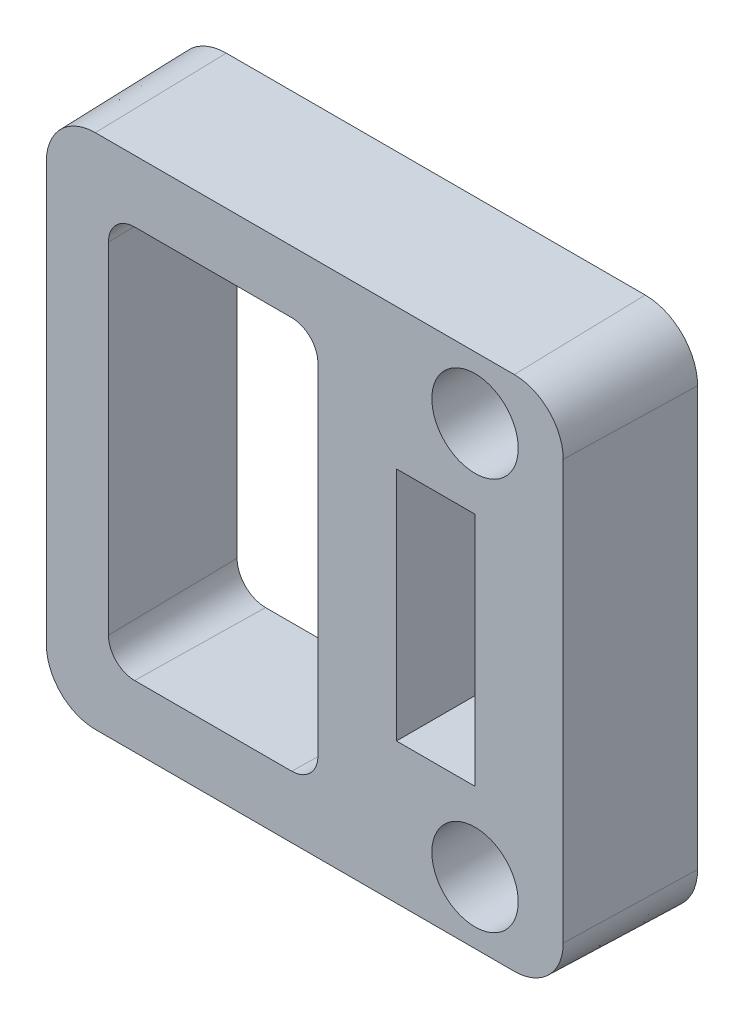
ISO-10303-21;
HEADER;
FILE_DESCRIPTION(('STEP AP214'),'2;1');
FILE_NAME('part.step','',(''),(''),'','','');
FILE_SCHEMA(('AUTOMOTIVE_DESIGN { 1 0 10303 214 1 1 1 1 }'));
ENDSEC;
DATA;
#1=APPLICATION_CONTEXT('core data for automotive mechanical design processes');
#2=APPLICATION_PROTOCOL_DEFINITION('international standard','automotive_design',2000,#1);
#3=PRODUCT_CONTEXT('',#1,'mechanical');
#4=PRODUCT('Part','Part','',(#3));
#5=PRODUCT_RELATED_PRODUCT_CATEGORY('part','',(#4));
#6=PRODUCT_DEFINITION_FORMATION('','',#4);
#7=PRODUCT_DEFINITION_CONTEXT('part definition',#1,'design');
#8=PRODUCT_DEFINITION('design','',#6,#7);
#9=PRODUCT_DEFINITION_SHAPE('','',#8);
#10=(LENGTH_UNIT() NAMED_UNIT(*) SI_UNIT(.MILLI.,.METRE.));
#11=(NAMED_UNIT(*) PLANE_ANGLE_UNIT() SI_UNIT($,.RADIAN.));
#12=(NAMED_UNIT(*) SI_UNIT($,.STERADIAN.) SOLID_ANGLE_UNIT());
#13=UNCERTAINTY_MEASURE_WITH_UNIT(LENGTH_MEASURE(1.E-05),#10,'distance_accuracy_value','');
#14=(GEOMETRIC_REPRESENTATION_CONTEXT(3) GLOBAL_UNCERTAINTY_ASSIGNED_CONTEXT((#13)) GLOBAL_UNIT_ASSIGNED_CONTEXT((#10,
#11,#12)) REPRESENTATION_CONTEXT('',''));
#15=CARTESIAN_POINT('',(0.,0.,0.));
#16=DIRECTION('',(0.,0.,1.));
#17=DIRECTION('',(1.,0.,0.));
#18=AXIS2_PLACEMENT_3D('',#15,#16,#17);
#19=CARTESIAN_POINT('',(0.,0.,5.));
#20=DIRECTION('',(0.,0.,-1.));
#21=DIRECTION('',(-1.,0.,0.));
#22=AXIS2_PLACEMENT_3D('',#19,#20,#21);
#23=PLANE('',#22);
#24=DIRECTION('',(-1.,0.,0.));
#25=VECTOR('',#24,1.);
#26=CARTESIAN_POINT('',(0.,-9.86907039215407,5.));
#27=LINE('',#26,#25);
#28=CARTESIAN_POINT('',(-8.,-9.86907039215407,5.));
#29=VERTEX_POINT('',#28);
#30=CARTESIAN_POINT('',(8.,-9.86907039215407,5.));
#31=VERTEX_POINT('',#30);
#32=EDGE_CURVE('E255',#29,#31,#27,.F.);
#33=ORIENTED_EDGE('',*,*,#32,.T.);
#34=CARTESIAN_POINT('',(8.,-8.,5.));
#35=DIRECTION('',(0.,0.,-1.));
#36=DIRECTION('',(-1.,0.,0.));
#37=AXIS2_PLACEMENT_3D('',#34,#35,#36);
#38=CIRCLE('',#37,1.86907039215406);
#39=CARTESIAN_POINT('',(9.86907039215406,-8.,5.));
#40=VERTEX_POINT('',#39);
#41=EDGE_CURVE('E244',#31,#40,#38,.F.);
#42=ORIENTED_EDGE('',*,*,#41,.T.);
#43=DIRECTION('',(0.,-1.,0.));
#44=VECTOR('',#43,1.);
#45=CARTESIAN_POINT('',(9.86907039215406,0.,5.));
#46=LINE('',#45,#44);
#47=CARTESIAN_POINT('',(9.86907039215406,8.,5.));
#48=VERTEX_POINT('',#47);
#49=EDGE_CURVE('E212',#40,#48,#46,.F.);
#50=ORIENTED_EDGE('',*,*,#49,.T.);
#51=CARTESIAN_POINT('',(8.,8.,5.));
#52=DIRECTION('',(0.,0.,-1.));
#53=DIRECTION('',(-1.,0.,0.));
#54=AXIS2_PLACEMENT_3D('',#51,#52,#53);
#55=CIRCLE('',#54,1.86907039215406);
#56=CARTESIAN_POINT('',(8.,9.86907039215407,5.));
#57=VERTEX_POINT('',#56);
#58=EDGE_CURVE('E242',#48,#57,#55,.F.);
#59=ORIENTED_EDGE('',*,*,#58,.T.);
#60=DIRECTION('',(1.,0.,0.));
#61=VECTOR('',#60,1.);
#62=CARTESIAN_POINT('',(0.,9.86907039215407,5.));
#63=LINE('',#62,#61);
#64=CARTESIAN_POINT('',(-8.,9.86907039215407,5.));
#65=VERTEX_POINT('',#64);
#66=EDGE_CURVE('E245',#57,#65,#63,.F.);
#67=ORIENTED_EDGE('',*,*,#66,.T.);
#68=CARTESIAN_POINT('',(-8.,8.,5.));
#69=DIRECTION('',(0.,0.,-1.));
#70=DIRECTION('',(-1.,0.,0.));
#71=AXIS2_PLACEMENT_3D('',#68,#69,#70);
#72=CIRCLE('',#71,1.86907039215406);
#73=CARTESIAN_POINT('',(-9.86907039215407,8.,5.));
#74=VERTEX_POINT('',#73);
#75=EDGE_CURVE('E246',#65,#74,#72,.F.);
#76=ORIENTED_EDGE('',*,*,#75,.T.);
#77=DIRECTION('',(0.,1.,0.));
#78=VECTOR('',#77,1.);
#79=CARTESIAN_POINT('',(-9.86907039215407,0.,5.));
#80=LINE('',#79,#78);
#81=CARTESIAN_POINT('',(-9.86907039215407,-8.,5.));
#82=VERTEX_POINT('',#81);
#83=EDGE_CURVE('E247',#74,#82,#80,.F.);
#84=ORIENTED_EDGE('',*,*,#83,.T.);
#85=CARTESIAN_POINT('',(-8.,-8.,5.));
#86=DIRECTION('',(0.,0.,-1.));
#87=DIRECTION('',(-1.,0.,0.));
#88=AXIS2_PLACEMENT_3D('',#85,#86,#87);
#89=CIRCLE('',#88,1.86907039215406);
#90=EDGE_CURVE('E253',#82,#29,#89,.F.);
#91=ORIENTED_EDGE('',*,*,#90,.T.);
#92=EDGE_LOOP('',(#33,#42,#50,#59,#67,#76,#84,#91));
#93=FACE_BOUND('',#92,.T.);
#94=CARTESIAN_POINT('',(6.5,7.5,5.));
#95=DIRECTION('',(0.,0.,1.));
#96=DIRECTION('',(1.,0.,0.));
#97=AXIS2_PLACEMENT_3D('',#94,#95,#96);
#98=CIRCLE('',#97,1.65);
#99=CARTESIAN_POINT('',(8.15,7.5,5.));
#100=VERTEX_POINT('',#99);
#101=EDGE_CURVE('E195',#100,#100,#98,.T.);
#102=ORIENTED_EDGE('',*,*,#101,.F.);
#103=EDGE_LOOP('',(#102));
#104=FACE_BOUND('',#103,.T.);
#105=CARTESIAN_POINT('',(6.5,-7.5,5.));
#106=DIRECTION('',(0.,0.,1.));
#107=DIRECTION('',(-1.,0.,0.));
#108=AXIS2_PLACEMENT_3D('',#105,#106,#107);
#109=CIRCLE('',#108,1.65);
#110=CARTESIAN_POINT('',(4.85,-7.5,5.));
#111=VERTEX_POINT('',#110);
#112=EDGE_CURVE('E193',#111,#111,#109,.T.);
#113=ORIENTED_EDGE('',*,*,#112,.F.);
#114=EDGE_LOOP('',(#113));
#115=FACE_BOUND('',#114,.T.);
#116=DIRECTION('',(1.,0.,0.));
#117=VECTOR('',#116,1.);
#118=CARTESIAN_POINT('',(3.5,-4.5,5.));
#119=LINE('',#118,#117);
#120=CARTESIAN_POINT('',(3.5,-4.5,5.));
#121=VERTEX_POINT('',#120);
#122=CARTESIAN_POINT('',(6.5,-4.5,5.));
#123=VERTEX_POINT('',#122);
#124=EDGE_CURVE('E176',#121,#123,#119,.T.);
#125=ORIENTED_EDGE('',*,*,#124,.F.);
#126=DIRECTION('',(0.,-1.,0.));
#127=VECTOR('',#126,1.);
#128=CARTESIAN_POINT('',(3.5,4.5,5.));
#129=LINE('',#128,#127);
#130=CARTESIAN_POINT('',(3.5,4.5,5.));
#131=VERTEX_POINT('',#130);
#132=EDGE_CURVE('E179',#131,#121,#129,.T.);
#133=ORIENTED_EDGE('',*,*,#132,.F.);
#134=DIRECTION('',(-1.,0.,0.));
#135=VECTOR('',#134,1.);
#136=CARTESIAN_POINT('',(3.5,4.5,5.));
#137=LINE('',#136,#135);
#138=CARTESIAN_POINT('',(6.5,4.5,5.));
#139=VERTEX_POINT('',#138);
#140=EDGE_CURVE('E183',#139,#131,#137,.T.);
#141=ORIENTED_EDGE('',*,*,#140,.F.);
#142=DIRECTION('',(0.,1.,0.));
#143=VECTOR('',#142,1.);
#144=CARTESIAN_POINT('',(6.5,4.5,5.));
#145=LINE('',#144,#143);
#146=EDGE_CURVE('E163',#123,#139,#145,.T.);
#147=ORIENTED_EDGE('',*,*,#146,.F.);
#148=EDGE_LOOP('',(#125,#133,#141,#147));
#149=FACE_BOUND('',#148,.T.);
#150=DIRECTION('',(1.,0.,0.));
#151=VECTOR('',#150,1.);
#152=CARTESIAN_POINT('',(-7.5,-7.5,5.));
#153=LINE('',#152,#151);
#154=CARTESIAN_POINT('',(-6.5,-7.5,5.));
#155=VERTEX_POINT('',#154);
#156=CARTESIAN_POINT('',(-0.5,-7.5,5.));
#157=VERTEX_POINT('',#156);
#158=EDGE_CURVE('E306',#155,#157,#153,.T.);
#159=ORIENTED_EDGE('',*,*,#158,.F.);
#160=CARTESIAN_POINT('',(-6.5,-6.5,5.));
#161=DIRECTION('',(0.,0.,-1.));
#162=DIRECTION('',(-1.,0.,0.));
#163=AXIS2_PLACEMENT_3D('',#160,#161,#162);
#164=CIRCLE('',#163,1.);
#165=CARTESIAN_POINT('',(-7.5,-6.5,5.));
#166=VERTEX_POINT('',#165);
#167=EDGE_CURVE('E89',#155,#166,#164,.T.);
#168=ORIENTED_EDGE('',*,*,#167,.T.);
#169=DIRECTION('',(0.,1.,0.));
#170=VECTOR('',#169,1.);
#171=CARTESIAN_POINT('',(-7.5,-7.5,5.));
#172=LINE('',#171,#170);
#173=CARTESIAN_POINT('',(-7.5,6.5,5.));
#174=VERTEX_POINT('',#173);
#175=EDGE_CURVE('E327',#166,#174,#172,.T.);
#176=ORIENTED_EDGE('',*,*,#175,.T.);
#177=CARTESIAN_POINT('',(-6.5,6.5,5.));
#178=DIRECTION('',(0.,0.,-1.));
#179=DIRECTION('',(-1.,0.,0.));
#180=AXIS2_PLACEMENT_3D('',#177,#178,#179);
#181=CIRCLE('',#180,1.);
#182=CARTESIAN_POINT('',(-6.5,7.5,5.));
#183=VERTEX_POINT('',#182);
#184=EDGE_CURVE('E30',#174,#183,#181,.T.);
#185=ORIENTED_EDGE('',*,*,#184,.T.);
#186=DIRECTION('',(1.,0.,0.));
#187=VECTOR('',#186,1.);
#188=CARTESIAN_POINT('',(-7.5,7.5,5.));
#189=LINE('',#188,#187);
#190=CARTESIAN_POINT('',(-0.5,7.5,5.));
#191=VERTEX_POINT('',#190);
#192=EDGE_CURVE('E320',#183,#191,#189,.T.);
#193=ORIENTED_EDGE('',*,*,#192,.T.);
#194=CARTESIAN_POINT('',(-0.5,6.5,5.));
#195=DIRECTION('',(0.,0.,-1.));
#196=DIRECTION('',(-1.,0.,0.));
#197=AXIS2_PLACEMENT_3D('',#194,#195,#196);
#198=CIRCLE('',#197,1.);
#199=CARTESIAN_POINT('',(0.5,6.5,5.));
#200=VERTEX_POINT('',#199);
#201=EDGE_CURVE('E263',#191,#200,#198,.T.);
#202=ORIENTED_EDGE('',*,*,#201,.T.);
#203=DIRECTION('',(0.,1.,0.));
#204=VECTOR('',#203,1.);
#205=CARTESIAN_POINT('',(0.5,-7.5,5.));
#206=LINE('',#205,#204);
#207=CARTESIAN_POINT('',(0.5,-6.5,5.));
#208=VERTEX_POINT('',#207);
#209=EDGE_CURVE('E332',#208,#200,#206,.T.);
#210=ORIENTED_EDGE('',*,*,#209,.F.);
#211=CARTESIAN_POINT('',(-0.5,-6.5,5.));
#212=DIRECTION('',(0.,0.,-1.));
#213=DIRECTION('',(-1.,0.,0.));
#214=AXIS2_PLACEMENT_3D('',#211,#212,#213);
#215=CIRCLE('',#214,1.);
#216=EDGE_CURVE('E270',#208,#157,#215,.T.);
#217=ORIENTED_EDGE('',*,*,#216,.T.);
#218=EDGE_LOOP('',(#159,#168,#176,#185,#193,#202,#210,#217));
#219=FACE_BOUND('',#218,.T.);
#220=ADVANCED_FACE('F17',(#93,#104,#115,#149,#219),#23,.F.);
#221=CARTESIAN_POINT('',(0.,0.,0.));
#222=DIRECTION('',(0.,0.,-1.));
#223=DIRECTION('',(-1.,0.,0.));
#224=AXIS2_PLACEMENT_3D('',#221,#222,#223);
#225=PLANE('',#224);
#226=DIRECTION('',(0.,1.,0.));
#227=VECTOR('',#226,1.);
#228=CARTESIAN_POINT('',(3.41272467535891,4.5,0.));
#229=LINE('',#228,#227);
#230=CARTESIAN_POINT('',(3.41272467535891,4.58727532464109,0.));
#231=VERTEX_POINT('',#230);
#232=CARTESIAN_POINT('',(3.41272467535891,-4.58727532464109,0.));
#233=VERTEX_POINT('',#232);
#234=EDGE_CURVE('E184',#231,#233,#229,.F.);
#235=ORIENTED_EDGE('',*,*,#234,.T.);
#236=DIRECTION('',(-1.,0.,0.));
#237=VECTOR('',#236,1.);
#238=CARTESIAN_POINT('',(3.5,-4.58727532464109,0.));
#239=LINE('',#238,#237);
#240=CARTESIAN_POINT('',(6.58727532464109,-4.58727532464109,0.));
#241=VERTEX_POINT('',#240);
#242=EDGE_CURVE('E282',#233,#241,#239,.F.);
#243=ORIENTED_EDGE('',*,*,#242,.T.);
#244=DIRECTION('',(0.,-1.,0.));
#245=VECTOR('',#244,1.);
#246=CARTESIAN_POINT('',(6.58727532464109,4.5,0.));
#247=LINE('',#246,#245);
#248=CARTESIAN_POINT('',(6.58727532464109,4.58727532464109,0.));
#249=VERTEX_POINT('',#248);
#250=EDGE_CURVE('E170',#241,#249,#247,.F.);
#251=ORIENTED_EDGE('',*,*,#250,.T.);
#252=DIRECTION('',(1.,0.,0.));
#253=VECTOR('',#252,1.);
#254=CARTESIAN_POINT('',(3.5,4.58727532464109,0.));
#255=LINE('',#254,#253);
#256=EDGE_CURVE('E277',#249,#231,#255,.F.);
#257=ORIENTED_EDGE('',*,*,#256,.T.);
#258=EDGE_LOOP('',(#235,#243,#251,#257));
#259=FACE_BOUND('',#258,.T.);
#260=CARTESIAN_POINT('',(6.5,-7.5,0.));
#261=DIRECTION('',(0.,0.,1.));
#262=DIRECTION('',(-1.,0.,0.));
#263=AXIS2_PLACEMENT_3D('',#260,#261,#262);
#264=CIRCLE('',#263,1.65);
#265=CARTESIAN_POINT('',(4.85,-7.5,0.));
#266=VERTEX_POINT('',#265);
#267=EDGE_CURVE('E188',#266,#266,#264,.T.);
#268=ORIENTED_EDGE('',*,*,#267,.T.);
#269=EDGE_LOOP('',(#268));
#270=FACE_BOUND('',#269,.T.);
#271=CARTESIAN_POINT('',(6.5,7.5,0.));
#272=DIRECTION('',(0.,0.,1.));
#273=DIRECTION('',(1.,0.,0.));
#274=AXIS2_PLACEMENT_3D('',#271,#272,#273);
#275=CIRCLE('',#274,1.65);
#276=CARTESIAN_POINT('',(8.15,7.5,0.));
#277=VERTEX_POINT('',#276);
#278=EDGE_CURVE('E197',#277,#277,#275,.T.);
#279=ORIENTED_EDGE('',*,*,#278,.T.);
#280=EDGE_LOOP('',(#279));
#281=FACE_BOUND('',#280,.T.);
#282=DIRECTION('',(0.,1.,0.));
#283=VECTOR('',#282,1.);
#284=CARTESIAN_POINT('',(10.,-10.,0.));
#285=LINE('',#284,#283);
#286=CARTESIAN_POINT('',(10.,-8.,0.));
#287=VERTEX_POINT('',#286);
#288=CARTESIAN_POINT('',(10.,8.,0.));
#289=VERTEX_POINT('',#288);
#290=EDGE_CURVE('E199',#287,#289,#285,.T.);
#291=ORIENTED_EDGE('',*,*,#290,.F.);
#292=CARTESIAN_POINT('',(8.,-8.,0.));
#293=DIRECTION('',(0.,0.,-1.));
#294=DIRECTION('',(-1.,0.,0.));
#295=AXIS2_PLACEMENT_3D('',#292,#293,#294);
#296=CIRCLE('',#295,2.);
#297=CARTESIAN_POINT('',(8.,-10.,0.));
#298=VERTEX_POINT('',#297);
#299=EDGE_CURVE('E225',#287,#298,#296,.T.);
#300=ORIENTED_EDGE('',*,*,#299,.T.);
#301=DIRECTION('',(1.,0.,0.));
#302=VECTOR('',#301,1.);
#303=CARTESIAN_POINT('',(-10.,-10.,0.));
#304=LINE('',#303,#302);
#305=CARTESIAN_POINT('',(-8.,-10.,0.));
#306=VERTEX_POINT('',#305);
#307=EDGE_CURVE('E211',#306,#298,#304,.T.);
#308=ORIENTED_EDGE('',*,*,#307,.F.);
#309=CARTESIAN_POINT('',(-8.,-8.,0.));
#310=DIRECTION('',(0.,0.,-1.));
#311=DIRECTION('',(-1.,0.,0.));
#312=AXIS2_PLACEMENT_3D('',#309,#310,#311);
#313=CIRCLE('',#312,2.);
#314=CARTESIAN_POINT('',(-10.,-8.,0.));
#315=VERTEX_POINT('',#314);
#316=EDGE_CURVE('E214',#306,#315,#313,.T.);
#317=ORIENTED_EDGE('',*,*,#316,.T.);
#318=DIRECTION('',(0.,-1.,0.));
#319=VECTOR('',#318,1.);
#320=CARTESIAN_POINT('',(-10.,-10.,0.));
#321=LINE('',#320,#319);
#322=CARTESIAN_POINT('',(-10.,8.,0.));
#323=VERTEX_POINT('',#322);
#324=EDGE_CURVE('E208',#323,#315,#321,.T.);
#325=ORIENTED_EDGE('',*,*,#324,.F.);
#326=CARTESIAN_POINT('',(-8.,8.,0.));
#327=DIRECTION('',(0.,0.,-1.));
#328=DIRECTION('',(-1.,0.,0.));
#329=AXIS2_PLACEMENT_3D('',#326,#327,#328);
#330=CIRCLE('',#329,2.);
#331=CARTESIAN_POINT('',(-8.,10.,0.));
#332=VERTEX_POINT('',#331);
#333=EDGE_CURVE('E220',#323,#332,#330,.T.);
#334=ORIENTED_EDGE('',*,*,#333,.T.);
#335=DIRECTION('',(-1.,0.,0.));
#336=VECTOR('',#335,1.);
#337=CARTESIAN_POINT('',(-10.,10.,0.));
#338=LINE('',#337,#336);
#339=CARTESIAN_POINT('',(8.,10.,0.));
#340=VERTEX_POINT('',#339);
#341=EDGE_CURVE('E202',#340,#332,#338,.T.);
#342=ORIENTED_EDGE('',*,*,#341,.F.);
#343=CARTESIAN_POINT('',(8.,8.,0.));
#344=DIRECTION('',(0.,0.,-1.));
#345=DIRECTION('',(-1.,0.,0.));
#346=AXIS2_PLACEMENT_3D('',#343,#344,#345);
#347=CIRCLE('',#346,2.);
#348=EDGE_CURVE('E219',#340,#289,#347,.T.);
#349=ORIENTED_EDGE('',*,*,#348,.T.);
#350=EDGE_LOOP('',(#291,#300,#308,#317,#325,#334,#342,#349));
#351=FACE_BOUND('',#350,.T.);
#352=DIRECTION('',(1.,0.,0.));
#353=VECTOR('',#352,1.);
#354=CARTESIAN_POINT('',(-7.5,7.58727532464109,0.));
#355=LINE('',#354,#353);
#356=CARTESIAN_POINT('',(-6.5,7.58727532464109,0.));
#357=VERTEX_POINT('',#356);
#358=CARTESIAN_POINT('',(-0.5,7.58727532464109,0.));
#359=VERTEX_POINT('',#358);
#360=EDGE_CURVE('E301',#357,#359,#355,.T.);
#361=ORIENTED_EDGE('',*,*,#360,.F.);
#362=CARTESIAN_POINT('',(-6.5,6.5,0.));
#363=DIRECTION('',(0.,0.,-1.));
#364=DIRECTION('',(-1.,0.,0.));
#365=AXIS2_PLACEMENT_3D('',#362,#363,#364);
#366=CIRCLE('',#365,1.08727532464109);
#367=CARTESIAN_POINT('',(-7.58727532464109,6.5,0.));
#368=VERTEX_POINT('',#367);
#369=EDGE_CURVE('E11',#357,#368,#366,.F.);
#370=ORIENTED_EDGE('',*,*,#369,.T.);
#371=DIRECTION('',(0.,1.,0.));
#372=VECTOR('',#371,1.);
#373=CARTESIAN_POINT('',(-7.58727532464109,-7.5,0.));
#374=LINE('',#373,#372);
#375=CARTESIAN_POINT('',(-7.58727532464109,-6.5,0.));
#376=VERTEX_POINT('',#375);
#377=EDGE_CURVE('E302',#376,#368,#374,.T.);
#378=ORIENTED_EDGE('',*,*,#377,.F.);
#379=CARTESIAN_POINT('',(-6.5,-6.5,0.));
#380=DIRECTION('',(0.,0.,-1.));
#381=DIRECTION('',(-1.,0.,0.));
#382=AXIS2_PLACEMENT_3D('',#379,#380,#381);
#383=CIRCLE('',#382,1.08727532464109);
#384=CARTESIAN_POINT('',(-6.5,-7.58727532464109,0.));
#385=VERTEX_POINT('',#384);
#386=EDGE_CURVE('E85',#376,#385,#383,.F.);
#387=ORIENTED_EDGE('',*,*,#386,.T.);
#388=DIRECTION('',(-1.,0.,0.));
#389=VECTOR('',#388,1.);
#390=CARTESIAN_POINT('',(-7.5,-7.58727532464109,0.));
#391=LINE('',#390,#389);
#392=CARTESIAN_POINT('',(-0.5,-7.58727532464109,0.));
#393=VERTEX_POINT('',#392);
#394=EDGE_CURVE('E299',#385,#393,#391,.F.);
#395=ORIENTED_EDGE('',*,*,#394,.T.);
#396=CARTESIAN_POINT('',(-0.5,-6.5,0.));
#397=DIRECTION('',(0.,0.,-1.));
#398=DIRECTION('',(-1.,0.,0.));
#399=AXIS2_PLACEMENT_3D('',#396,#397,#398);
#400=CIRCLE('',#399,1.08727532464109);
#401=CARTESIAN_POINT('',(0.587275324641085,-6.5,0.));
#402=VERTEX_POINT('',#401);
#403=EDGE_CURVE('E269',#393,#402,#400,.F.);
#404=ORIENTED_EDGE('',*,*,#403,.T.);
#405=DIRECTION('',(0.,-1.,0.));
#406=VECTOR('',#405,1.);
#407=CARTESIAN_POINT('',(0.587275324641085,-7.5,0.));
#408=LINE('',#407,#406);
#409=CARTESIAN_POINT('',(0.587275324641085,6.5,0.));
#410=VERTEX_POINT('',#409);
#411=EDGE_CURVE('E300',#402,#410,#408,.F.);
#412=ORIENTED_EDGE('',*,*,#411,.T.);
#413=CARTESIAN_POINT('',(-0.5,6.5,0.));
#414=DIRECTION('',(0.,0.,-1.));
#415=DIRECTION('',(-1.,0.,0.));
#416=AXIS2_PLACEMENT_3D('',#413,#414,#415);
#417=CIRCLE('',#416,1.08727532464109);
#418=EDGE_CURVE('E264',#410,#359,#417,.F.);
#419=ORIENTED_EDGE('',*,*,#418,.T.);
#420=EDGE_LOOP('',(#361,#370,#378,#387,#395,#404,#412,#419));
#421=FACE_BOUND('',#420,.T.);
#422=ADVANCED_FACE('F319',(#259,#270,#281,#351,#421),#225,.T.);
#423=CARTESIAN_POINT('',(10.,-10.,0.));
#424=DIRECTION('',(0.999657324975557,0.,0.0261769483078732));
#425=DIRECTION('',(0.0261769483078732,0.,-0.999657324975557));
#426=AXIS2_PLACEMENT_3D('',#423,#424,#425);
#427=PLANE('',#426);
#428=ORIENTED_EDGE('',*,*,#49,.F.);
#429=DIRECTION('',(0.0261769483078732,0.,-0.999657324975557));
#430=VECTOR('',#429,1.);
#431=CARTESIAN_POINT('',(10.,-8.,0.));
#432=LINE('',#431,#430);
#433=EDGE_CURVE('E217',#40,#287,#432,.T.);
#434=ORIENTED_EDGE('',*,*,#433,.T.);
#435=ORIENTED_EDGE('',*,*,#290,.T.);
#436=DIRECTION('',(0.0261769483078732,0.,-0.999657324975557));
#437=VECTOR('',#436,1.);
#438=CARTESIAN_POINT('',(10.,8.,0.));
#439=LINE('',#438,#437);
#440=EDGE_CURVE('E227',#289,#48,#439,.F.);
#441=ORIENTED_EDGE('',*,*,#440,.T.);
#442=EDGE_LOOP('',(#428,#434,#435,#441));
#443=FACE_BOUND('',#442,.T.);
#444=ADVANCED_FACE('F344',(#443),#427,.T.);
#445=CARTESIAN_POINT('',(-10.,10.,0.));
#446=DIRECTION('',(0.,0.999657324975557,0.0261769483078732));
#447=DIRECTION('',(0.,-0.0261769483078732,0.999657324975557));
#448=AXIS2_PLACEMENT_3D('',#445,#446,#447);
#449=PLANE('',#448);
#450=ORIENTED_EDGE('',*,*,#66,.F.);
#451=DIRECTION('',(0.,0.0261769483078732,-0.999657324975557));
#452=VECTOR('',#451,1.);
#453=CARTESIAN_POINT('',(8.,10.,0.));
#454=LINE('',#453,#452);
#455=EDGE_CURVE('E240',#57,#340,#454,.T.);
#456=ORIENTED_EDGE('',*,*,#455,.T.);
#457=ORIENTED_EDGE('',*,*,#341,.T.);
#458=DIRECTION('',(0.,0.0261769483078732,-0.999657324975557));
#459=VECTOR('',#458,1.);
#460=CARTESIAN_POINT('',(-8.,10.,0.));
#461=LINE('',#460,#459);
#462=EDGE_CURVE('E237',#332,#65,#461,.F.);
#463=ORIENTED_EDGE('',*,*,#462,.T.);
#464=EDGE_LOOP('',(#450,#456,#457,#463));
#465=FACE_BOUND('',#464,.T.);
#466=ADVANCED_FACE('F370',(#465),#449,.T.);
#467=CARTESIAN_POINT('',(-10.,-10.,0.));
#468=DIRECTION('',(-0.999657324975557,0.,0.0261769483078732));
#469=DIRECTION('',(0.0261769483078732,0.,0.999657324975557));
#470=AXIS2_PLACEMENT_3D('',#467,#468,#469);
#471=PLANE('',#470);
#472=ORIENTED_EDGE('',*,*,#83,.F.);
#473=DIRECTION('',(-0.0261769483078732,0.,-0.999657324975557));
#474=VECTOR('',#473,1.);
#475=CARTESIAN_POINT('',(-10.,8.,0.));
#476=LINE('',#475,#474);
#477=EDGE_CURVE('E231',#74,#323,#476,.T.);
#478=ORIENTED_EDGE('',*,*,#477,.T.);
#479=ORIENTED_EDGE('',*,*,#324,.T.);
#480=DIRECTION('',(-0.0261769483078732,0.,-0.999657324975557));
#481=VECTOR('',#480,1.);
#482=CARTESIAN_POINT('',(-10.,-8.,0.));
#483=LINE('',#482,#481);
#484=EDGE_CURVE('E234',#315,#82,#483,.F.);
#485=ORIENTED_EDGE('',*,*,#484,.T.);
#486=EDGE_LOOP('',(#472,#478,#479,#485));
#487=FACE_BOUND('',#486,.T.);
#488=ADVANCED_FACE('F374',(#487),#471,.T.);
#489=CARTESIAN_POINT('',(-10.,-10.,0.));
#490=DIRECTION('',(0.,-0.999657324975557,0.0261769483078732));
#491=DIRECTION('',(0.,-0.0261769483078732,-0.999657324975557));
#492=AXIS2_PLACEMENT_3D('',#489,#490,#491);
#493=PLANE('',#492);
#494=ORIENTED_EDGE('',*,*,#307,.T.);
#495=DIRECTION('',(0.,-0.0261769483078732,-0.999657324975557));
#496=VECTOR('',#495,1.);
#497=CARTESIAN_POINT('',(8.,-10.,0.));
#498=LINE('',#497,#496);
#499=EDGE_CURVE('E230',#298,#31,#498,.F.);
#500=ORIENTED_EDGE('',*,*,#499,.T.);
#501=ORIENTED_EDGE('',*,*,#32,.F.);
#502=DIRECTION('',(0.,-0.0261769483078732,-0.999657324975557));
#503=VECTOR('',#502,1.);
#504=CARTESIAN_POINT('',(-8.,-10.,0.));
#505=LINE('',#504,#503);
#506=EDGE_CURVE('E221',#29,#306,#505,.T.);
#507=ORIENTED_EDGE('',*,*,#506,.T.);
#508=EDGE_LOOP('',(#494,#500,#501,#507));
#509=FACE_BOUND('',#508,.T.);
#510=ADVANCED_FACE('F383',(#509),#493,.T.);
#511=CARTESIAN_POINT('',(6.5,7.5,0.));
#512=DIRECTION('',(0.,0.,1.));
#513=DIRECTION('',(1.,0.,0.));
#514=AXIS2_PLACEMENT_3D('',#511,#512,#513);
#515=CYLINDRICAL_SURFACE('',#514,1.65);
#516=ORIENTED_EDGE('',*,*,#278,.F.);
#517=EDGE_LOOP('',(#516));
#518=FACE_BOUND('',#517,.T.);
#519=ORIENTED_EDGE('',*,*,#101,.T.);
#520=EDGE_LOOP('',(#519));
#521=FACE_BOUND('',#520,.T.);
#522=ADVANCED_FACE('F407',(#518,#521),#515,.F.);
#523=CARTESIAN_POINT('',(6.5,-7.5,0.));
#524=DIRECTION('',(0.,0.,1.));
#525=DIRECTION('',(1.,0.,0.));
#526=AXIS2_PLACEMENT_3D('',#523,#524,#525);
#527=CYLINDRICAL_SURFACE('',#526,1.65);
#528=ORIENTED_EDGE('',*,*,#267,.F.);
#529=EDGE_LOOP('',(#528));
#530=FACE_BOUND('',#529,.T.);
#531=ORIENTED_EDGE('',*,*,#112,.T.);
#532=EDGE_LOOP('',(#531));
#533=FACE_BOUND('',#532,.T.);
#534=ADVANCED_FACE('F431',(#530,#533),#527,.F.);
#535=CARTESIAN_POINT('',(3.5,4.5,5.));
#536=DIRECTION('',(0.999847695156391,0.,-0.0174524064372835));
#537=DIRECTION('',(-0.0174524064372835,0.,-0.999847695156391));
#538=AXIS2_PLACEMENT_3D('',#535,#536,#537);
#539=PLANE('',#538);
#540=ORIENTED_EDGE('',*,*,#132,.T.);
#541=DIRECTION('',(0.0174497491606827,0.0174497491606827,0.999695459881887));
#542=VECTOR('',#541,1.);
#543=CARTESIAN_POINT('',(3.50274044371193,-4.49725955628806,5.15699991510811));
#544=LINE('',#543,#542);
#545=EDGE_CURVE('E172',#233,#121,#544,.T.);
#546=ORIENTED_EDGE('',*,*,#545,.F.);
#547=ORIENTED_EDGE('',*,*,#234,.F.);
#548=DIRECTION('',(0.0174497491606827,-0.0174497491606827,0.999695459881887));
#549=VECTOR('',#548,1.);
#550=CARTESIAN_POINT('',(3.5,4.5,5.));
#551=LINE('',#550,#549);
#552=EDGE_CURVE('E198',#231,#131,#551,.T.);
#553=ORIENTED_EDGE('',*,*,#552,.T.);
#554=EDGE_LOOP('',(#540,#546,#547,#553));
#555=FACE_BOUND('',#554,.T.);
#556=ADVANCED_FACE('F337',(#555),#539,.T.);
#557=CARTESIAN_POINT('',(3.5,4.5,5.));
#558=DIRECTION('',(0.,-0.999847695156391,-0.0174524064372835));
#559=DIRECTION('',(0.,0.0174524064372835,-0.999847695156391));
#560=AXIS2_PLACEMENT_3D('',#557,#558,#559);
#561=PLANE('',#560);
#562=ORIENTED_EDGE('',*,*,#140,.T.);
#563=ORIENTED_EDGE('',*,*,#552,.F.);
#564=ORIENTED_EDGE('',*,*,#256,.F.);
#565=DIRECTION('',(-0.0174497491606827,-0.0174497491606827,0.999695459881887));
#566=VECTOR('',#565,1.);
#567=CARTESIAN_POINT('',(6.5,4.5,5.));
#568=LINE('',#567,#566);
#569=EDGE_CURVE('E171',#249,#139,#568,.T.);
#570=ORIENTED_EDGE('',*,*,#569,.T.);
#571=EDGE_LOOP('',(#562,#563,#564,#570));
#572=FACE_BOUND('',#571,.T.);
#573=ADVANCED_FACE('F341',(#572),#561,.T.);
#574=CARTESIAN_POINT('',(6.5,4.5,5.));
#575=DIRECTION('',(-0.999847695156391,0.,-0.0174524064372835));
#576=DIRECTION('',(-0.0174524064372835,0.,0.999847695156391));
#577=AXIS2_PLACEMENT_3D('',#574,#575,#576);
#578=PLANE('',#577);
#579=ORIENTED_EDGE('',*,*,#146,.T.);
#580=ORIENTED_EDGE('',*,*,#569,.F.);
#581=ORIENTED_EDGE('',*,*,#250,.F.);
#582=DIRECTION('',(-0.0174497491606827,0.0174497491606827,0.999695459881887));
#583=VECTOR('',#582,1.);
#584=CARTESIAN_POINT('',(6.49908651876269,-4.49908651876268,5.05233330503604));
#585=LINE('',#584,#583);
#586=EDGE_CURVE('E159',#241,#123,#585,.T.);
#587=ORIENTED_EDGE('',*,*,#586,.T.);
#588=EDGE_LOOP('',(#579,#580,#581,#587));
#589=FACE_BOUND('',#588,.T.);
#590=ADVANCED_FACE('F165',(#589),#578,.T.);
#591=CARTESIAN_POINT('',(3.5,-4.5,5.));
#592=DIRECTION('',(0.,0.999847695156391,-0.0174524064372835));
#593=DIRECTION('',(0.,0.0174524064372835,0.999847695156391));
#594=AXIS2_PLACEMENT_3D('',#591,#592,#593);
#595=PLANE('',#594);
#596=ORIENTED_EDGE('',*,*,#124,.T.);
#597=ORIENTED_EDGE('',*,*,#586,.F.);
#598=ORIENTED_EDGE('',*,*,#242,.F.);
#599=ORIENTED_EDGE('',*,*,#545,.T.);
#600=EDGE_LOOP('',(#596,#597,#598,#599));
#601=FACE_BOUND('',#600,.T.);
#602=ADVANCED_FACE('F180',(#601),#595,.T.);
#603=CARTESIAN_POINT('',(-7.5,-7.5,5.));
#604=DIRECTION('',(0.999847695156391,0.,-0.0174524064372835));
#605=DIRECTION('',(-0.0174524064372835,0.,-0.999847695156391));
#606=AXIS2_PLACEMENT_3D('',#603,#604,#605);
#607=PLANE('',#606);
#608=ORIENTED_EDGE('',*,*,#175,.F.);
#609=DIRECTION('',(0.0174524064372835,0.,0.999847695156391));
#610=VECTOR('',#609,1.);
#611=CARTESIAN_POINT('',(-7.5,-6.5,5.));
#612=LINE('',#611,#610);
#613=EDGE_CURVE('E293',#166,#376,#612,.F.);
#614=ORIENTED_EDGE('',*,*,#613,.T.);
#615=ORIENTED_EDGE('',*,*,#377,.T.);
#616=DIRECTION('',(0.0174524064372835,0.,0.999847695156391));
#617=VECTOR('',#616,1.);
#618=CARTESIAN_POINT('',(-7.5,6.5,5.));
#619=LINE('',#618,#617);
#620=EDGE_CURVE('E289',#368,#174,#619,.T.);
#621=ORIENTED_EDGE('',*,*,#620,.T.);
#622=EDGE_LOOP('',(#608,#614,#615,#621));
#623=FACE_BOUND('',#622,.T.);
#624=ADVANCED_FACE('F330',(#623),#607,.T.);
#625=CARTESIAN_POINT('',(-7.5,7.5,5.));
#626=DIRECTION('',(0.,-0.999847695156391,-0.0174524064372835));
#627=DIRECTION('',(0.,0.0174524064372835,-0.999847695156391));
#628=AXIS2_PLACEMENT_3D('',#625,#626,#627);
#629=PLANE('',#628);
#630=ORIENTED_EDGE('',*,*,#192,.F.);
#631=DIRECTION('',(0.,-0.0174524064372835,0.999847695156391));
#632=VECTOR('',#631,1.);
#633=CARTESIAN_POINT('',(-6.5,7.5,5.));
#634=LINE('',#633,#632);
#635=EDGE_CURVE('E275',#183,#357,#634,.F.);
#636=ORIENTED_EDGE('',*,*,#635,.T.);
#637=ORIENTED_EDGE('',*,*,#360,.T.);
#638=DIRECTION('',(0.,-0.0174524064372835,0.999847695156391));
#639=VECTOR('',#638,1.);
#640=CARTESIAN_POINT('',(-0.5,7.5,5.));
#641=LINE('',#640,#639);
#642=EDGE_CURVE('E232',#359,#191,#641,.T.);
#643=ORIENTED_EDGE('',*,*,#642,.T.);
#644=EDGE_LOOP('',(#630,#636,#637,#643));
#645=FACE_BOUND('',#644,.T.);
#646=ADVANCED_FACE('F316',(#645),#629,.T.);
#647=CARTESIAN_POINT('',(0.5,-7.5,5.));
#648=DIRECTION('',(-0.999847695156391,0.,-0.0174524064372835));
#649=DIRECTION('',(-0.0174524064372835,0.,0.999847695156391));
#650=AXIS2_PLACEMENT_3D('',#647,#648,#649);
#651=PLANE('',#650);
#652=ORIENTED_EDGE('',*,*,#209,.T.);
#653=DIRECTION('',(-0.0174524064372835,0.,0.999847695156391));
#654=VECTOR('',#653,1.);
#655=CARTESIAN_POINT('',(0.5,6.5,5.));
#656=LINE('',#655,#654);
#657=EDGE_CURVE('E21',#200,#410,#656,.F.);
#658=ORIENTED_EDGE('',*,*,#657,.T.);
#659=ORIENTED_EDGE('',*,*,#411,.F.);
#660=DIRECTION('',(-0.0174524064372835,0.,0.999847695156391));
#661=VECTOR('',#660,1.);
#662=CARTESIAN_POINT('',(0.5,-6.5,5.));
#663=LINE('',#662,#661);
#664=EDGE_CURVE('E285',#402,#208,#663,.T.);
#665=ORIENTED_EDGE('',*,*,#664,.T.);
#666=EDGE_LOOP('',(#652,#658,#659,#665));
#667=FACE_BOUND('',#666,.T.);
#668=ADVANCED_FACE('F19',(#667),#651,.T.);
#669=CARTESIAN_POINT('',(-7.5,-7.5,5.));
#670=DIRECTION('',(0.,0.999847695156391,-0.0174524064372835));
#671=DIRECTION('',(0.,0.0174524064372835,0.999847695156391));
#672=AXIS2_PLACEMENT_3D('',#669,#670,#671);
#673=PLANE('',#672);
#674=ORIENTED_EDGE('',*,*,#394,.F.);
#675=DIRECTION('',(0.,0.0174524064372835,0.999847695156391));
#676=VECTOR('',#675,1.);
#677=CARTESIAN_POINT('',(-6.5,-7.5,5.));
#678=LINE('',#677,#676);
#679=EDGE_CURVE('E288',#385,#155,#678,.T.);
#680=ORIENTED_EDGE('',*,*,#679,.T.);
#681=ORIENTED_EDGE('',*,*,#158,.T.);
#682=DIRECTION('',(0.,0.0174524064372835,0.999847695156391));
#683=VECTOR('',#682,1.);
#684=CARTESIAN_POINT('',(-0.5,-7.5,5.));
#685=LINE('',#684,#683);
#686=EDGE_CURVE('E266',#157,#393,#685,.F.);
#687=ORIENTED_EDGE('',*,*,#686,.T.);
#688=EDGE_LOOP('',(#674,#680,#681,#687));
#689=FACE_BOUND('',#688,.T.);
#690=ADVANCED_FACE('F386',(#689),#673,.T.);
#691=CARTESIAN_POINT('',(8.,-8.,0.));
#692=DIRECTION('',(0.,0.,-1.));
#693=DIRECTION('',(-1.,0.,0.));
#694=AXIS2_PLACEMENT_3D('',#691,#692,#693);
#695=CONICAL_SURFACE('',#694,2.,0.026179938779915);
#696=ORIENTED_EDGE('',*,*,#41,.F.);
#697=ORIENTED_EDGE('',*,*,#499,.F.);
#698=ORIENTED_EDGE('',*,*,#299,.F.);
#699=ORIENTED_EDGE('',*,*,#433,.F.);
#700=EDGE_LOOP('',(#696,#697,#698,#699));
#701=FACE_BOUND('',#700,.T.);
#702=ADVANCED_FACE('F390',(#701),#695,.T.);
#703=CARTESIAN_POINT('',(8.,8.,0.));
#704=DIRECTION('',(0.,0.,-1.));
#705=DIRECTION('',(-1.,0.,0.));
#706=AXIS2_PLACEMENT_3D('',#703,#704,#705);
#707=CONICAL_SURFACE('',#706,2.,0.026179938779915);
#708=ORIENTED_EDGE('',*,*,#58,.F.);
#709=ORIENTED_EDGE('',*,*,#440,.F.);
#710=ORIENTED_EDGE('',*,*,#348,.F.);
#711=ORIENTED_EDGE('',*,*,#455,.F.);
#712=EDGE_LOOP('',(#708,#709,#710,#711));
#713=FACE_BOUND('',#712,.T.);
#714=ADVANCED_FACE('F359',(#713),#707,.T.);
#715=CARTESIAN_POINT('',(-8.,8.,0.));
#716=DIRECTION('',(0.,0.,-1.));
#717=DIRECTION('',(-1.,0.,0.));
#718=AXIS2_PLACEMENT_3D('',#715,#716,#717);
#719=CONICAL_SURFACE('',#718,2.,0.026179938779915);
#720=ORIENTED_EDGE('',*,*,#75,.F.);
#721=ORIENTED_EDGE('',*,*,#462,.F.);
#722=ORIENTED_EDGE('',*,*,#333,.F.);
#723=ORIENTED_EDGE('',*,*,#477,.F.);
#724=EDGE_LOOP('',(#720,#721,#722,#723));
#725=FACE_BOUND('',#724,.T.);
#726=ADVANCED_FACE('F367',(#725),#719,.T.);
#727=CARTESIAN_POINT('',(-8.,-8.,0.));
#728=DIRECTION('',(0.,0.,-1.));
#729=DIRECTION('',(-1.,0.,0.));
#730=AXIS2_PLACEMENT_3D('',#727,#728,#729);
#731=CONICAL_SURFACE('',#730,2.,0.026179938779915);
#732=ORIENTED_EDGE('',*,*,#90,.F.);
#733=ORIENTED_EDGE('',*,*,#484,.F.);
#734=ORIENTED_EDGE('',*,*,#316,.F.);
#735=ORIENTED_EDGE('',*,*,#506,.F.);
#736=EDGE_LOOP('',(#732,#733,#734,#735));
#737=FACE_BOUND('',#736,.T.);
#738=ADVANCED_FACE('F377',(#737),#731,.T.);
#739=CARTESIAN_POINT('',(-0.5,6.5,5.));
#740=DIRECTION('',(0.,0.,-1.));
#741=DIRECTION('',(-1.,0.,0.));
#742=AXIS2_PLACEMENT_3D('',#739,#740,#741);
#743=CONICAL_SURFACE('',#742,1.,0.0174532925199433);
#744=ORIENTED_EDGE('',*,*,#418,.F.);
#745=ORIENTED_EDGE('',*,*,#657,.F.);
#746=ORIENTED_EDGE('',*,*,#201,.F.);
#747=ORIENTED_EDGE('',*,*,#642,.F.);
#748=EDGE_LOOP('',(#744,#745,#746,#747));
#749=FACE_BOUND('',#748,.T.);
#750=ADVANCED_FACE('F424',(#749),#743,.F.);
#751=CARTESIAN_POINT('',(-0.5,-6.5,5.));
#752=DIRECTION('',(0.,0.,-1.));
#753=DIRECTION('',(-1.,0.,0.));
#754=AXIS2_PLACEMENT_3D('',#751,#752,#753);
#755=CONICAL_SURFACE('',#754,1.,0.0174532925199433);
#756=ORIENTED_EDGE('',*,*,#403,.F.);
#757=ORIENTED_EDGE('',*,*,#686,.F.);
#758=ORIENTED_EDGE('',*,*,#216,.F.);
#759=ORIENTED_EDGE('',*,*,#664,.F.);
#760=EDGE_LOOP('',(#756,#757,#758,#759));
#761=FACE_BOUND('',#760,.T.);
#762=ADVANCED_FACE('F436',(#761),#755,.F.);
#763=CARTESIAN_POINT('',(-6.5,-6.5,5.));
#764=DIRECTION('',(0.,0.,-1.));
#765=DIRECTION('',(-1.,0.,0.));
#766=AXIS2_PLACEMENT_3D('',#763,#764,#765);
#767=CONICAL_SURFACE('',#766,1.,0.0174532925199433);
#768=ORIENTED_EDGE('',*,*,#386,.F.);
#769=ORIENTED_EDGE('',*,*,#613,.F.);
#770=ORIENTED_EDGE('',*,*,#167,.F.);
#771=ORIENTED_EDGE('',*,*,#679,.F.);
#772=EDGE_LOOP('',(#768,#769,#770,#771));
#773=FACE_BOUND('',#772,.T.);
#774=ADVANCED_FACE('F437',(#773),#767,.F.);
#775=CARTESIAN_POINT('',(-6.5,6.5,5.));
#776=DIRECTION('',(0.,0.,-1.));
#777=DIRECTION('',(-1.,0.,0.));
#778=AXIS2_PLACEMENT_3D('',#775,#776,#777);
#779=CONICAL_SURFACE('',#778,1.,0.0174532925199433);
#780=ORIENTED_EDGE('',*,*,#369,.F.);
#781=ORIENTED_EDGE('',*,*,#635,.F.);
#782=ORIENTED_EDGE('',*,*,#184,.F.);
#783=ORIENTED_EDGE('',*,*,#620,.F.);
#784=EDGE_LOOP('',(#780,#781,#782,#783));
#785=FACE_BOUND('',#784,.T.);
#786=ADVANCED_FACE('F322',(#785),#779,.F.);
#787=CLOSED_SHELL('',(#220,#422,#444,#466,#488,#510,#522,#534,#556,#573,#590,#602,#624,#646,
#668,#690,#702,#714,#726,#738,#750,#762,#774,#786));
#788=MANIFOLD_SOLID_BREP('B1',#787);
#789=ADVANCED_BREP_SHAPE_REPRESENTATION('',(#18,#788),#14);
#790=SHAPE_DEFINITION_REPRESENTATION(#9,#789);
ENDSEC;
END-ISO-10303-21;
